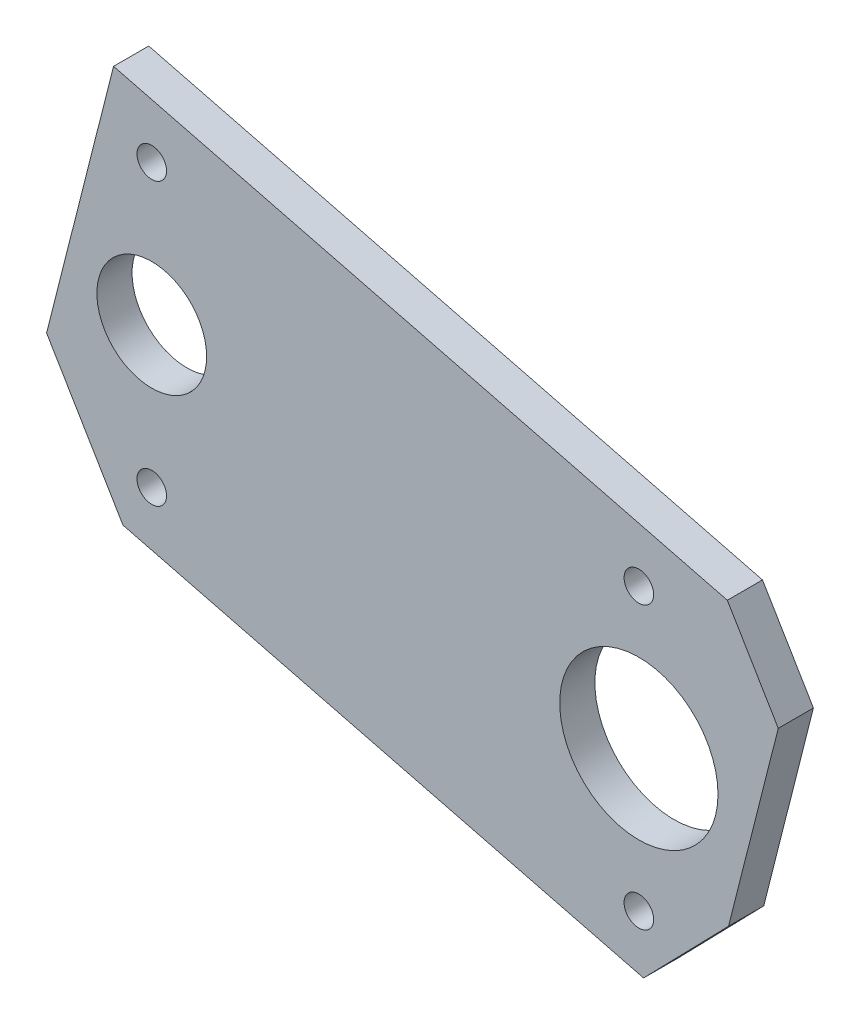
ISO-10303-21;
HEADER;
FILE_DESCRIPTION(('STEP AP214'),'2;1');
FILE_NAME('part.step','',(''),(''),'','','');
FILE_SCHEMA(('AUTOMOTIVE_DESIGN { 1 0 10303 214 1 1 1 1 }'));
ENDSEC;
DATA;
#1=APPLICATION_CONTEXT('core data for automotive mechanical design processes');
#2=APPLICATION_PROTOCOL_DEFINITION('international standard','automotive_design',2000,#1);
#3=PRODUCT_CONTEXT('',#1,'mechanical');
#4=PRODUCT('Part','Part','',(#3));
#5=PRODUCT_RELATED_PRODUCT_CATEGORY('part','',(#4));
#6=PRODUCT_DEFINITION_FORMATION('','',#4);
#7=PRODUCT_DEFINITION_CONTEXT('part definition',#1,'design');
#8=PRODUCT_DEFINITION('design','',#6,#7);
#9=PRODUCT_DEFINITION_SHAPE('','',#8);
#10=(LENGTH_UNIT() NAMED_UNIT(*) SI_UNIT(.MILLI.,.METRE.));
#11=(NAMED_UNIT(*) PLANE_ANGLE_UNIT() SI_UNIT($,.RADIAN.));
#12=(NAMED_UNIT(*) SI_UNIT($,.STERADIAN.) SOLID_ANGLE_UNIT());
#13=UNCERTAINTY_MEASURE_WITH_UNIT(LENGTH_MEASURE(1.E-05),#10,'distance_accuracy_value','');
#14=(GEOMETRIC_REPRESENTATION_CONTEXT(3) GLOBAL_UNCERTAINTY_ASSIGNED_CONTEXT((#13)) GLOBAL_UNIT_ASSIGNED_CONTEXT((#10,
#11,#12)) REPRESENTATION_CONTEXT('',''));
#15=CARTESIAN_POINT('',(0.,0.,0.));
#16=DIRECTION('',(0.,0.,1.));
#17=DIRECTION('',(1.,0.,0.));
#18=AXIS2_PLACEMENT_3D('',#15,#16,#17);
#19=CARTESIAN_POINT('',(0.,0.,6.35));
#20=DIRECTION('',(0.,0.,-1.));
#21=DIRECTION('',(-1.,0.,0.));
#22=AXIS2_PLACEMENT_3D('',#19,#20,#21);
#23=PLANE('',#22);
#24=CARTESIAN_POINT('',(19.05,79.4275238732197,6.35));
#25=DIRECTION('',(0.,0.,1.));
#26=DIRECTION('',(1.,0.,0.));
#27=AXIS2_PLACEMENT_3D('',#24,#25,#26);
#28=CIRCLE('',#27,2.66700000000001);
#29=CARTESIAN_POINT('',(21.717,79.4275238732197,6.35));
#30=VERTEX_POINT('',#29);
#31=EDGE_CURVE('E182',#30,#30,#28,.T.);
#32=ORIENTED_EDGE('',*,*,#31,.F.);
#33=EDGE_LOOP('',(#32));
#34=FACE_BOUND('',#33,.T.);
#35=CARTESIAN_POINT('',(106.981625,57.15,6.35));
#36=DIRECTION('',(0.,0.,1.));
#37=DIRECTION('',(1.,0.,0.));
#38=AXIS2_PLACEMENT_3D('',#35,#36,#37);
#39=CIRCLE('',#38,2.667);
#40=CARTESIAN_POINT('',(109.648625,57.15,6.35));
#41=VERTEX_POINT('',#40);
#42=EDGE_CURVE('E170',#41,#41,#39,.T.);
#43=ORIENTED_EDGE('',*,*,#42,.F.);
#44=EDGE_LOOP('',(#43));
#45=FACE_BOUND('',#44,.T.);
#46=CARTESIAN_POINT('',(19.05,54.0275238732197,6.35));
#47=DIRECTION('',(0.,0.,1.));
#48=DIRECTION('',(1.,0.,0.));
#49=AXIS2_PLACEMENT_3D('',#46,#47,#48);
#50=CIRCLE('',#49,9.906);
#51=CARTESIAN_POINT('',(28.956,54.0275238732197,6.35));
#52=VERTEX_POINT('',#51);
#53=EDGE_CURVE('E128',#52,#52,#50,.T.);
#54=ORIENTED_EDGE('',*,*,#53,.F.);
#55=EDGE_LOOP('',(#54));
#56=FACE_BOUND('',#55,.T.);
#57=DIRECTION('',(-0.245591282890976,-0.969373468673434,0.));
#58=VECTOR('',#57,1.);
#59=CARTESIAN_POINT('',(0.0620352528053008,43.2640691060581,6.35));
#60=LINE('',#59,#58);
#61=CARTESIAN_POINT('',(12.1559746804221,91.0000631318707,6.35));
#62=VERTEX_POINT('',#61);
#63=CARTESIAN_POINT('',(0.0620352528053008,43.2640691060581,6.35));
#64=VERTEX_POINT('',#63);
#65=EDGE_CURVE('E137',#62,#64,#60,.T.);
#66=ORIENTED_EDGE('',*,*,#65,.T.);
#67=DIRECTION('',(0.511791291668797,-0.859109814733824,0.));
#68=VECTOR('',#67,1.);
#69=CARTESIAN_POINT('',(13.8500858919611,20.1189905887561,6.35));
#70=LINE('',#69,#68);
#71=CARTESIAN_POINT('',(13.8500858919611,20.1189905887561,6.35));
#72=VERTEX_POINT('',#71);
#73=EDGE_CURVE('E90',#64,#72,#70,.T.);
#74=ORIENTED_EDGE('',*,*,#73,.T.);
#75=DIRECTION('',(0.969373468673434,-0.245591282890976,0.));
#76=VECTOR('',#75,1.);
#77=CARTESIAN_POINT('',(107.83227580501,-3.69144711719347,6.35));
#78=LINE('',#77,#76);
#79=CARTESIAN_POINT('',(107.83227580501,-3.69144711719347,6.35));
#80=VERTEX_POINT('',#79);
#81=EDGE_CURVE('E149',#72,#80,#78,.T.);
#82=ORIENTED_EDGE('',*,*,#81,.T.);
#83=DIRECTION('',(0.697375024268314,0.716706408180343,0.));
#84=VECTOR('',#83,1.);
#85=CARTESIAN_POINT('',(123.172465774331,12.0739761789042,6.35));
#86=LINE('',#85,#84);
#87=CARTESIAN_POINT('',(123.172465774331,12.0739761789042,6.35));
#88=VERTEX_POINT('',#87);
#89=EDGE_CURVE('E106',#80,#88,#86,.T.);
#90=ORIENTED_EDGE('',*,*,#89,.T.);
#91=DIRECTION('',(0.245591282890975,0.969373468673434,0.));
#92=VECTOR('',#91,1.);
#93=CARTESIAN_POINT('',(132.147395909233,47.4989271525642,6.35));
#94=LINE('',#93,#92);
#95=CARTESIAN_POINT('',(132.147395909233,47.4989271525642,6.35));
#96=VERTEX_POINT('',#95);
#97=EDGE_CURVE('E100',#88,#96,#94,.T.);
#98=ORIENTED_EDGE('',*,*,#97,.T.);
#99=DIRECTION('',(-0.511791291668799,0.859109814733822,0.));
#100=VECTOR('',#99,1.);
#101=CARTESIAN_POINT('',(122.955362149796,62.9289794974321,6.35));
#102=LINE('',#101,#100);
#103=CARTESIAN_POINT('',(122.955362149796,62.9289794974321,6.35));
#104=VERTEX_POINT('',#103);
#105=EDGE_CURVE('E104',#96,#104,#102,.T.);
#106=ORIENTED_EDGE('',*,*,#105,.T.);
#107=DIRECTION('',(-0.969373468673434,0.245591282890976,0.));
#108=VECTOR('',#107,1.);
#109=CARTESIAN_POINT('',(12.1559746804221,91.0000631318707,6.35));
#110=LINE('',#109,#108);
#111=EDGE_CURVE('E50',#104,#62,#110,.T.);
#112=ORIENTED_EDGE('',*,*,#111,.T.);
#113=EDGE_LOOP('',(#66,#74,#82,#90,#98,#106,#112));
#114=FACE_BOUND('',#113,.T.);
#115=CARTESIAN_POINT('',(106.981625,31.75,6.35));
#116=DIRECTION('',(0.,0.,1.));
#117=DIRECTION('',(1.,0.,0.));
#118=AXIS2_PLACEMENT_3D('',#115,#116,#117);
#119=CIRCLE('',#118,14.2875);
#120=CARTESIAN_POINT('',(121.269125,31.75,6.35));
#121=VERTEX_POINT('',#120);
#122=EDGE_CURVE('E164',#121,#121,#119,.T.);
#123=ORIENTED_EDGE('',*,*,#122,.F.);
#124=EDGE_LOOP('',(#123));
#125=FACE_BOUND('',#124,.T.);
#126=CARTESIAN_POINT('',(106.981625,6.35,6.35));
#127=DIRECTION('',(0.,0.,1.));
#128=DIRECTION('',(1.,0.,0.));
#129=AXIS2_PLACEMENT_3D('',#126,#127,#128);
#130=CIRCLE('',#129,2.667);
#131=CARTESIAN_POINT('',(109.648625,6.35,6.35));
#132=VERTEX_POINT('',#131);
#133=EDGE_CURVE('E176',#132,#132,#130,.T.);
#134=ORIENTED_EDGE('',*,*,#133,.F.);
#135=EDGE_LOOP('',(#134));
#136=FACE_BOUND('',#135,.T.);
#137=CARTESIAN_POINT('',(19.05,28.6275238732197,6.35));
#138=DIRECTION('',(0.,0.,1.));
#139=DIRECTION('',(1.,0.,0.));
#140=AXIS2_PLACEMENT_3D('',#137,#138,#139);
#141=CIRCLE('',#140,2.667);
#142=CARTESIAN_POINT('',(21.717,28.6275238732197,6.35));
#143=VERTEX_POINT('',#142);
#144=EDGE_CURVE('E188',#143,#143,#141,.T.);
#145=ORIENTED_EDGE('',*,*,#144,.F.);
#146=EDGE_LOOP('',(#145));
#147=FACE_BOUND('',#146,.T.);
#148=ADVANCED_FACE('F33',(#34,#45,#56,#114,#125,#136,#147),#23,.F.);
#149=CARTESIAN_POINT('',(0.,0.,0.));
#150=DIRECTION('',(0.,0.,-1.));
#151=DIRECTION('',(-1.,0.,0.));
#152=AXIS2_PLACEMENT_3D('',#149,#150,#151);
#153=PLANE('',#152);
#154=CARTESIAN_POINT('',(19.05,79.4275238732197,0.));
#155=DIRECTION('',(0.,0.,1.));
#156=DIRECTION('',(1.,0.,0.));
#157=AXIS2_PLACEMENT_3D('',#154,#155,#156);
#158=CIRCLE('',#157,2.66700000000001);
#159=CARTESIAN_POINT('',(21.717,79.4275238732197,0.));
#160=VERTEX_POINT('',#159);
#161=EDGE_CURVE('E185',#160,#160,#158,.T.);
#162=ORIENTED_EDGE('',*,*,#161,.T.);
#163=EDGE_LOOP('',(#162));
#164=FACE_BOUND('',#163,.T.);
#165=CARTESIAN_POINT('',(106.981625,57.15,0.));
#166=DIRECTION('',(0.,0.,1.));
#167=DIRECTION('',(1.,0.,0.));
#168=AXIS2_PLACEMENT_3D('',#165,#166,#167);
#169=CIRCLE('',#168,2.667);
#170=CARTESIAN_POINT('',(109.648625,57.15,0.));
#171=VERTEX_POINT('',#170);
#172=EDGE_CURVE('E173',#171,#171,#169,.T.);
#173=ORIENTED_EDGE('',*,*,#172,.T.);
#174=EDGE_LOOP('',(#173));
#175=FACE_BOUND('',#174,.T.);
#176=CARTESIAN_POINT('',(19.05,54.0275238732197,0.));
#177=DIRECTION('',(0.,0.,1.));
#178=DIRECTION('',(1.,0.,0.));
#179=AXIS2_PLACEMENT_3D('',#176,#177,#178);
#180=CIRCLE('',#179,9.906);
#181=CARTESIAN_POINT('',(28.956,54.0275238732197,0.));
#182=VERTEX_POINT('',#181);
#183=EDGE_CURVE('E161',#182,#182,#180,.T.);
#184=ORIENTED_EDGE('',*,*,#183,.T.);
#185=EDGE_LOOP('',(#184));
#186=FACE_BOUND('',#185,.T.);
#187=DIRECTION('',(-0.245591282890976,-0.969373468673434,0.));
#188=VECTOR('',#187,1.);
#189=CARTESIAN_POINT('',(0.0620352528053008,43.2640691060581,0.));
#190=LINE('',#189,#188);
#191=CARTESIAN_POINT('',(12.1559746804221,91.0000631318707,0.));
#192=VERTEX_POINT('',#191);
#193=CARTESIAN_POINT('',(0.0620352528053008,43.2640691060581,0.));
#194=VERTEX_POINT('',#193);
#195=EDGE_CURVE('E124',#192,#194,#190,.T.);
#196=ORIENTED_EDGE('',*,*,#195,.F.);
#197=DIRECTION('',(-0.969373468673434,0.245591282890976,0.));
#198=VECTOR('',#197,1.);
#199=CARTESIAN_POINT('',(12.1559746804221,91.0000631318707,0.));
#200=LINE('',#199,#198);
#201=CARTESIAN_POINT('',(122.955362149796,62.9289794974321,0.));
#202=VERTEX_POINT('',#201);
#203=EDGE_CURVE('E82',#202,#192,#200,.T.);
#204=ORIENTED_EDGE('',*,*,#203,.F.);
#205=DIRECTION('',(-0.511791291668799,0.859109814733822,0.));
#206=VECTOR('',#205,1.);
#207=CARTESIAN_POINT('',(122.955362149796,62.9289794974321,0.));
#208=LINE('',#207,#206);
#209=CARTESIAN_POINT('',(132.147395909233,47.4989271525642,0.));
#210=VERTEX_POINT('',#209);
#211=EDGE_CURVE('E76',#210,#202,#208,.T.);
#212=ORIENTED_EDGE('',*,*,#211,.F.);
#213=DIRECTION('',(0.245591282890975,0.969373468673434,0.));
#214=VECTOR('',#213,1.);
#215=CARTESIAN_POINT('',(132.147395909233,47.4989271525642,0.));
#216=LINE('',#215,#214);
#217=CARTESIAN_POINT('',(123.172465774331,12.0739761789042,0.));
#218=VERTEX_POINT('',#217);
#219=EDGE_CURVE('E114',#218,#210,#216,.T.);
#220=ORIENTED_EDGE('',*,*,#219,.F.);
#221=DIRECTION('',(0.697375024268314,0.716706408180343,0.));
#222=VECTOR('',#221,1.);
#223=CARTESIAN_POINT('',(123.172465774331,12.0739761789042,0.));
#224=LINE('',#223,#222);
#225=CARTESIAN_POINT('',(107.83227580501,-3.69144711719347,0.));
#226=VERTEX_POINT('',#225);
#227=EDGE_CURVE('E132',#226,#218,#224,.T.);
#228=ORIENTED_EDGE('',*,*,#227,.F.);
#229=DIRECTION('',(0.969373468673434,-0.245591282890976,0.));
#230=VECTOR('',#229,1.);
#231=CARTESIAN_POINT('',(107.83227580501,-3.69144711719347,0.));
#232=LINE('',#231,#230);
#233=CARTESIAN_POINT('',(13.8500858919611,20.1189905887561,0.));
#234=VERTEX_POINT('',#233);
#235=EDGE_CURVE('E130',#234,#226,#232,.T.);
#236=ORIENTED_EDGE('',*,*,#235,.F.);
#237=DIRECTION('',(0.511791291668797,-0.859109814733824,0.));
#238=VECTOR('',#237,1.);
#239=CARTESIAN_POINT('',(13.8500858919611,20.1189905887561,0.));
#240=LINE('',#239,#238);
#241=EDGE_CURVE('E127',#194,#234,#240,.T.);
#242=ORIENTED_EDGE('',*,*,#241,.F.);
#243=EDGE_LOOP('',(#196,#204,#212,#220,#228,#236,#242));
#244=FACE_BOUND('',#243,.T.);
#245=CARTESIAN_POINT('',(106.981625,31.75,0.));
#246=DIRECTION('',(0.,0.,1.));
#247=DIRECTION('',(1.,0.,0.));
#248=AXIS2_PLACEMENT_3D('',#245,#246,#247);
#249=CIRCLE('',#248,14.2875);
#250=CARTESIAN_POINT('',(121.269125,31.75,0.));
#251=VERTEX_POINT('',#250);
#252=EDGE_CURVE('E167',#251,#251,#249,.T.);
#253=ORIENTED_EDGE('',*,*,#252,.T.);
#254=EDGE_LOOP('',(#253));
#255=FACE_BOUND('',#254,.T.);
#256=CARTESIAN_POINT('',(106.981625,6.35,0.));
#257=DIRECTION('',(0.,0.,1.));
#258=DIRECTION('',(1.,0.,0.));
#259=AXIS2_PLACEMENT_3D('',#256,#257,#258);
#260=CIRCLE('',#259,2.667);
#261=CARTESIAN_POINT('',(109.648625,6.35,0.));
#262=VERTEX_POINT('',#261);
#263=EDGE_CURVE('E179',#262,#262,#260,.T.);
#264=ORIENTED_EDGE('',*,*,#263,.T.);
#265=EDGE_LOOP('',(#264));
#266=FACE_BOUND('',#265,.T.);
#267=CARTESIAN_POINT('',(19.05,28.6275238732197,0.));
#268=DIRECTION('',(0.,0.,1.));
#269=DIRECTION('',(1.,0.,0.));
#270=AXIS2_PLACEMENT_3D('',#267,#268,#269);
#271=CIRCLE('',#270,2.667);
#272=CARTESIAN_POINT('',(21.717,28.6275238732197,0.));
#273=VERTEX_POINT('',#272);
#274=EDGE_CURVE('E191',#273,#273,#271,.T.);
#275=ORIENTED_EDGE('',*,*,#274,.T.);
#276=EDGE_LOOP('',(#275));
#277=FACE_BOUND('',#276,.T.);
#278=ADVANCED_FACE('F153',(#164,#175,#186,#244,#255,#266,#277),#153,.T.);
#279=CARTESIAN_POINT('',(0.0620352528053008,43.2640691060581,6.35));
#280=DIRECTION('',(0.969373468673434,-0.245591282890976,0.));
#281=DIRECTION('',(0.245591282890976,0.969373468673434,0.));
#282=AXIS2_PLACEMENT_3D('',#279,#280,#281);
#283=PLANE('',#282);
#284=ORIENTED_EDGE('',*,*,#195,.T.);
#285=DIRECTION('',(0.,0.,-1.));
#286=VECTOR('',#285,1.);
#287=CARTESIAN_POINT('',(0.0620352528053008,43.2640691060581,6.35));
#288=LINE('',#287,#286);
#289=EDGE_CURVE('E11',#64,#194,#288,.T.);
#290=ORIENTED_EDGE('',*,*,#289,.F.);
#291=ORIENTED_EDGE('',*,*,#65,.F.);
#292=DIRECTION('',(0.,0.,-1.));
#293=VECTOR('',#292,1.);
#294=CARTESIAN_POINT('',(12.1559746804221,91.0000631318707,6.35));
#295=LINE('',#294,#293);
#296=EDGE_CURVE('E120',#62,#192,#295,.T.);
#297=ORIENTED_EDGE('',*,*,#296,.T.);
#298=EDGE_LOOP('',(#284,#290,#291,#297));
#299=FACE_BOUND('',#298,.T.);
#300=ADVANCED_FACE('F35',(#299),#283,.F.);
#301=CARTESIAN_POINT('',(13.8500858919611,20.1189905887561,6.35));
#302=DIRECTION('',(0.859109814733824,0.511791291668797,0.));
#303=DIRECTION('',(-0.511791291668797,0.859109814733824,0.));
#304=AXIS2_PLACEMENT_3D('',#301,#302,#303);
#305=PLANE('',#304);
#306=ORIENTED_EDGE('',*,*,#241,.T.);
#307=DIRECTION('',(0.,0.,-1.));
#308=VECTOR('',#307,1.);
#309=CARTESIAN_POINT('',(13.8500858919611,20.1189905887561,6.35));
#310=LINE('',#309,#308);
#311=EDGE_CURVE('E42',#72,#234,#310,.T.);
#312=ORIENTED_EDGE('',*,*,#311,.F.);
#313=ORIENTED_EDGE('',*,*,#73,.F.);
#314=ORIENTED_EDGE('',*,*,#289,.T.);
#315=EDGE_LOOP('',(#306,#312,#313,#314));
#316=FACE_BOUND('',#315,.T.);
#317=ADVANCED_FACE('F224',(#316),#305,.F.);
#318=CARTESIAN_POINT('',(107.83227580501,-3.69144711719347,6.35));
#319=DIRECTION('',(0.245591282890976,0.969373468673434,0.));
#320=DIRECTION('',(-0.969373468673434,0.245591282890976,0.));
#321=AXIS2_PLACEMENT_3D('',#318,#319,#320);
#322=PLANE('',#321);
#323=ORIENTED_EDGE('',*,*,#235,.T.);
#324=DIRECTION('',(0.,0.,-1.));
#325=VECTOR('',#324,1.);
#326=CARTESIAN_POINT('',(107.83227580501,-3.69144711719347,6.35));
#327=LINE('',#326,#325);
#328=EDGE_CURVE('E141',#80,#226,#327,.T.);
#329=ORIENTED_EDGE('',*,*,#328,.F.);
#330=ORIENTED_EDGE('',*,*,#81,.F.);
#331=ORIENTED_EDGE('',*,*,#311,.T.);
#332=EDGE_LOOP('',(#323,#329,#330,#331));
#333=FACE_BOUND('',#332,.T.);
#334=ADVANCED_FACE('F147',(#333),#322,.F.);
#335=CARTESIAN_POINT('',(123.172465774331,12.0739761789042,6.35));
#336=DIRECTION('',(-0.716706408180343,0.697375024268314,0.));
#337=DIRECTION('',(-0.697375024268314,-0.716706408180343,0.));
#338=AXIS2_PLACEMENT_3D('',#335,#336,#337);
#339=PLANE('',#338);
#340=ORIENTED_EDGE('',*,*,#227,.T.);
#341=DIRECTION('',(0.,0.,-1.));
#342=VECTOR('',#341,1.);
#343=CARTESIAN_POINT('',(123.172465774331,12.0739761789042,6.35));
#344=LINE('',#343,#342);
#345=EDGE_CURVE('E115',#88,#218,#344,.T.);
#346=ORIENTED_EDGE('',*,*,#345,.F.);
#347=ORIENTED_EDGE('',*,*,#89,.F.);
#348=ORIENTED_EDGE('',*,*,#328,.T.);
#349=EDGE_LOOP('',(#340,#346,#347,#348));
#350=FACE_BOUND('',#349,.T.);
#351=ADVANCED_FACE('F156',(#350),#339,.F.);
#352=CARTESIAN_POINT('',(132.147395909233,47.4989271525642,6.35));
#353=DIRECTION('',(-0.969373468673434,0.245591282890975,0.));
#354=DIRECTION('',(-0.245591282890975,-0.969373468673434,0.));
#355=AXIS2_PLACEMENT_3D('',#352,#353,#354);
#356=PLANE('',#355);
#357=ORIENTED_EDGE('',*,*,#219,.T.);
#358=DIRECTION('',(0.,0.,-1.));
#359=VECTOR('',#358,1.);
#360=CARTESIAN_POINT('',(132.147395909233,47.4989271525642,6.35));
#361=LINE('',#360,#359);
#362=EDGE_CURVE('E111',#96,#210,#361,.T.);
#363=ORIENTED_EDGE('',*,*,#362,.F.);
#364=ORIENTED_EDGE('',*,*,#97,.F.);
#365=ORIENTED_EDGE('',*,*,#345,.T.);
#366=EDGE_LOOP('',(#357,#363,#364,#365));
#367=FACE_BOUND('',#366,.T.);
#368=ADVANCED_FACE('F112',(#367),#356,.F.);
#369=CARTESIAN_POINT('',(122.955362149796,62.9289794974321,6.35));
#370=DIRECTION('',(-0.859109814733822,-0.511791291668799,0.));
#371=DIRECTION('',(0.511791291668799,-0.859109814733822,0.));
#372=AXIS2_PLACEMENT_3D('',#369,#370,#371);
#373=PLANE('',#372);
#374=ORIENTED_EDGE('',*,*,#211,.T.);
#375=DIRECTION('',(0.,0.,-1.));
#376=VECTOR('',#375,1.);
#377=CARTESIAN_POINT('',(122.955362149796,62.9289794974321,6.35));
#378=LINE('',#377,#376);
#379=EDGE_CURVE('E116',#104,#202,#378,.T.);
#380=ORIENTED_EDGE('',*,*,#379,.F.);
#381=ORIENTED_EDGE('',*,*,#105,.F.);
#382=ORIENTED_EDGE('',*,*,#362,.T.);
#383=EDGE_LOOP('',(#374,#380,#381,#382));
#384=FACE_BOUND('',#383,.T.);
#385=ADVANCED_FACE('F118',(#384),#373,.F.);
#386=CARTESIAN_POINT('',(12.1559746804221,91.0000631318707,6.35));
#387=DIRECTION('',(-0.245591282890976,-0.969373468673434,0.));
#388=DIRECTION('',(0.969373468673434,-0.245591282890976,0.));
#389=AXIS2_PLACEMENT_3D('',#386,#387,#388);
#390=PLANE('',#389);
#391=ORIENTED_EDGE('',*,*,#203,.T.);
#392=ORIENTED_EDGE('',*,*,#296,.F.);
#393=ORIENTED_EDGE('',*,*,#111,.F.);
#394=ORIENTED_EDGE('',*,*,#379,.T.);
#395=EDGE_LOOP('',(#391,#392,#393,#394));
#396=FACE_BOUND('',#395,.T.);
#397=ADVANCED_FACE('F214',(#396),#390,.F.);
#398=CARTESIAN_POINT('',(19.05,54.0275238732197,6.35));
#399=DIRECTION('',(0.,0.,-1.));
#400=DIRECTION('',(-1.,0.,0.));
#401=AXIS2_PLACEMENT_3D('',#398,#399,#400);
#402=CYLINDRICAL_SURFACE('',#401,9.906);
#403=ORIENTED_EDGE('',*,*,#53,.T.);
#404=EDGE_LOOP('',(#403));
#405=FACE_BOUND('',#404,.T.);
#406=ORIENTED_EDGE('',*,*,#183,.F.);
#407=EDGE_LOOP('',(#406));
#408=FACE_BOUND('',#407,.T.);
#409=ADVANCED_FACE('F211',(#405,#408),#402,.F.);
#410=CARTESIAN_POINT('',(106.981625,31.75,6.35));
#411=DIRECTION('',(0.,0.,-1.));
#412=DIRECTION('',(-1.,0.,0.));
#413=AXIS2_PLACEMENT_3D('',#410,#411,#412);
#414=CYLINDRICAL_SURFACE('',#413,14.2875);
#415=ORIENTED_EDGE('',*,*,#122,.T.);
#416=EDGE_LOOP('',(#415));
#417=FACE_BOUND('',#416,.T.);
#418=ORIENTED_EDGE('',*,*,#252,.F.);
#419=EDGE_LOOP('',(#418));
#420=FACE_BOUND('',#419,.T.);
#421=ADVANCED_FACE('F283',(#417,#420),#414,.F.);
#422=CARTESIAN_POINT('',(106.981625,57.15,6.35));
#423=DIRECTION('',(0.,0.,-1.));
#424=DIRECTION('',(-1.,0.,0.));
#425=AXIS2_PLACEMENT_3D('',#422,#423,#424);
#426=CYLINDRICAL_SURFACE('',#425,2.667);
#427=ORIENTED_EDGE('',*,*,#42,.T.);
#428=EDGE_LOOP('',(#427));
#429=FACE_BOUND('',#428,.T.);
#430=ORIENTED_EDGE('',*,*,#172,.F.);
#431=EDGE_LOOP('',(#430));
#432=FACE_BOUND('',#431,.T.);
#433=ADVANCED_FACE('F291',(#429,#432),#426,.F.);
#434=CARTESIAN_POINT('',(106.981625,6.35,6.35));
#435=DIRECTION('',(0.,0.,-1.));
#436=DIRECTION('',(-1.,0.,0.));
#437=AXIS2_PLACEMENT_3D('',#434,#435,#436);
#438=CYLINDRICAL_SURFACE('',#437,2.667);
#439=ORIENTED_EDGE('',*,*,#133,.T.);
#440=EDGE_LOOP('',(#439));
#441=FACE_BOUND('',#440,.T.);
#442=ORIENTED_EDGE('',*,*,#263,.F.);
#443=EDGE_LOOP('',(#442));
#444=FACE_BOUND('',#443,.T.);
#445=ADVANCED_FACE('F299',(#441,#444),#438,.F.);
#446=CARTESIAN_POINT('',(19.05,79.4275238732197,6.35));
#447=DIRECTION('',(0.,0.,-1.));
#448=DIRECTION('',(-1.,0.,0.));
#449=AXIS2_PLACEMENT_3D('',#446,#447,#448);
#450=CYLINDRICAL_SURFACE('',#449,2.66700000000001);
#451=ORIENTED_EDGE('',*,*,#31,.T.);
#452=EDGE_LOOP('',(#451));
#453=FACE_BOUND('',#452,.T.);
#454=ORIENTED_EDGE('',*,*,#161,.F.);
#455=EDGE_LOOP('',(#454));
#456=FACE_BOUND('',#455,.T.);
#457=ADVANCED_FACE('F308',(#453,#456),#450,.F.);
#458=CARTESIAN_POINT('',(19.05,28.6275238732197,6.35));
#459=DIRECTION('',(0.,0.,-1.));
#460=DIRECTION('',(-1.,0.,0.));
#461=AXIS2_PLACEMENT_3D('',#458,#459,#460);
#462=CYLINDRICAL_SURFACE('',#461,2.667);
#463=ORIENTED_EDGE('',*,*,#144,.T.);
#464=EDGE_LOOP('',(#463));
#465=FACE_BOUND('',#464,.T.);
#466=ORIENTED_EDGE('',*,*,#274,.F.);
#467=EDGE_LOOP('',(#466));
#468=FACE_BOUND('',#467,.T.);
#469=ADVANCED_FACE('F197',(#465,#468),#462,.F.);
#470=CLOSED_SHELL('',(#148,#278,#300,#317,#334,#351,#368,#385,#397,#409,#421,#433,#445,#457,#469));
#471=MANIFOLD_SOLID_BREP('B2',#470);
#472=ADVANCED_BREP_SHAPE_REPRESENTATION('',(#18,#471),#14);
#473=SHAPE_DEFINITION_REPRESENTATION(#9,#472);
ENDSEC;
END-ISO-10303-21;
